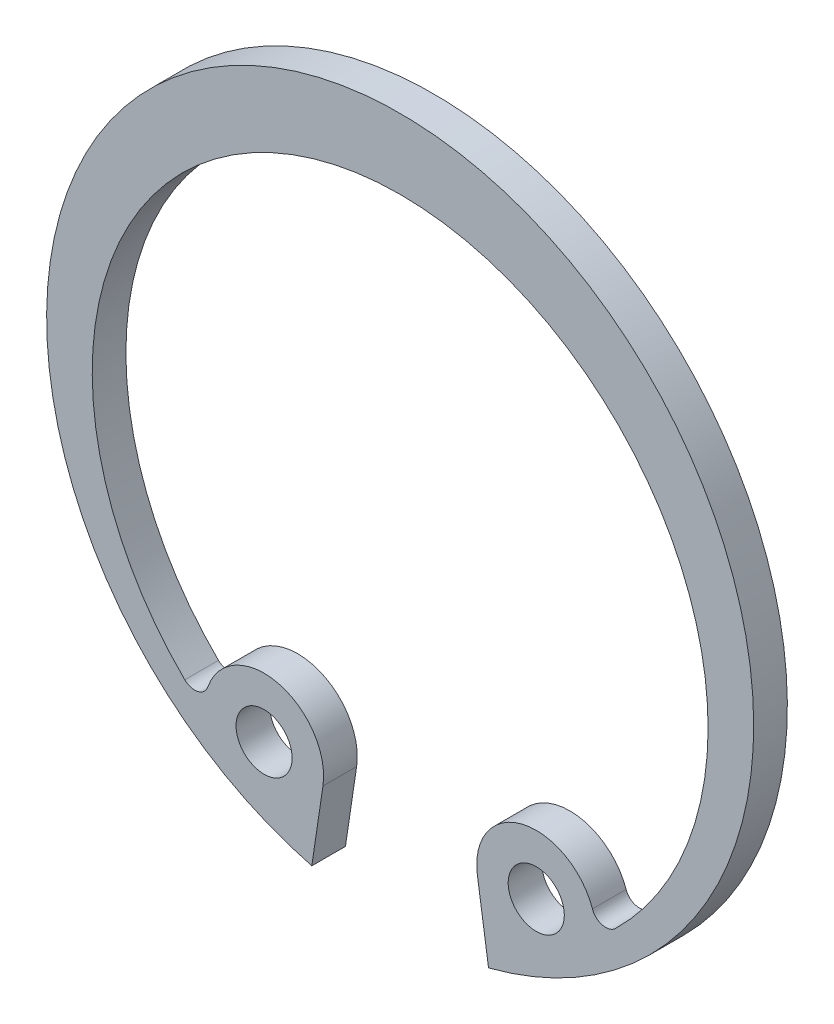
ISO-10303-21;
HEADER;
FILE_DESCRIPTION(('STEP AP214'),'2;1');
FILE_NAME('part.step','',(''),(''),'','','');
FILE_SCHEMA(('AUTOMOTIVE_DESIGN { 1 0 10303 214 1 1 1 1 }'));
ENDSEC;
DATA;
#1=APPLICATION_CONTEXT('core data for automotive mechanical design processes');
#2=APPLICATION_PROTOCOL_DEFINITION('international standard','automotive_design',2000,#1);
#3=PRODUCT_CONTEXT('',#1,'mechanical');
#4=PRODUCT('Part','Part','',(#3));
#5=PRODUCT_RELATED_PRODUCT_CATEGORY('part','',(#4));
#6=PRODUCT_DEFINITION_FORMATION('','',#4);
#7=PRODUCT_DEFINITION_CONTEXT('part definition',#1,'design');
#8=PRODUCT_DEFINITION('design','',#6,#7);
#9=PRODUCT_DEFINITION_SHAPE('','',#8);
#10=(LENGTH_UNIT() NAMED_UNIT(*) SI_UNIT(.MILLI.,.METRE.));
#11=(NAMED_UNIT(*) PLANE_ANGLE_UNIT() SI_UNIT($,.RADIAN.));
#12=(NAMED_UNIT(*) SI_UNIT($,.STERADIAN.) SOLID_ANGLE_UNIT());
#13=UNCERTAINTY_MEASURE_WITH_UNIT(LENGTH_MEASURE(1.E-05),#10,'distance_accuracy_value','');
#14=(GEOMETRIC_REPRESENTATION_CONTEXT(3) GLOBAL_UNCERTAINTY_ASSIGNED_CONTEXT((#13)) GLOBAL_UNIT_ASSIGNED_CONTEXT((#10,
#11,#12)) REPRESENTATION_CONTEXT('',''));
#15=CARTESIAN_POINT('',(0.,0.,0.));
#16=DIRECTION('',(0.,0.,1.));
#17=DIRECTION('',(1.,0.,0.));
#18=AXIS2_PLACEMENT_3D('',#15,#16,#17);
#19=CARTESIAN_POINT('',(-4.85,-9.22384113406593,1.2));
#20=DIRECTION('',(0.,0.,1.));
#21=DIRECTION('',(1.,0.,0.));
#22=AXIS2_PLACEMENT_3D('',#19,#20,#21);
#23=PLANE('',#22);
#24=CARTESIAN_POINT('',(-4.85,-9.22384113406593,1.2));
#25=DIRECTION('',(0.,0.,1.));
#26=DIRECTION('',(1.,0.,0.));
#27=AXIS2_PLACEMENT_3D('',#24,#25,#26);
#28=CIRCLE('',#27,1.);
#29=CARTESIAN_POINT('',(-3.85,-9.22384113406593,1.2));
#30=VERTEX_POINT('',#29);
#31=EDGE_CURVE('E134',#30,#30,#28,.T.);
#32=ORIENTED_EDGE('',*,*,#31,.F.);
#33=EDGE_LOOP('',(#32));
#34=FACE_BOUND('',#33,.T.);
#35=CARTESIAN_POINT('',(-4.85,-9.22384113406593,1.2));
#36=DIRECTION('',(0.,0.,1.));
#37=DIRECTION('',(1.,0.,0.));
#38=AXIS2_PLACEMENT_3D('',#35,#36,#37);
#39=CIRCLE('',#38,2.12121611264667);
#40=CARTESIAN_POINT('',(-2.75208361497354,-9.53737683855488,1.2));
#41=VERTEX_POINT('',#40);
#42=CARTESIAN_POINT('',(-6.85338907081207,-8.52671128425128,1.2));
#43=VERTEX_POINT('',#42);
#44=EDGE_CURVE('E145',#41,#43,#39,.T.);
#45=ORIENTED_EDGE('',*,*,#44,.T.);
#46=CARTESIAN_POINT('',(-7.32561560606887,-8.3623881288551,1.2));
#47=DIRECTION('',(0.,0.,-1.));
#48=DIRECTION('',(1.,0.,0.));
#49=AXIS2_PLACEMENT_3D('',#46,#47,#48);
#50=CIRCLE('',#49,0.499999999999999);
#51=CARTESIAN_POINT('',(-7.67528699538004,-8.71978135696273,1.2));
#52=VERTEX_POINT('',#51);
#53=EDGE_CURVE('E93',#43,#52,#50,.T.);
#54=ORIENTED_EDGE('',*,*,#53,.T.);
#55=CARTESIAN_POINT('',(0.,-0.875000000000001,1.2));
#56=DIRECTION('',(0.,0.,-1.));
#57=DIRECTION('',(1.,0.,0.));
#58=AXIS2_PLACEMENT_3D('',#55,#56,#57);
#59=CIRCLE('',#58,10.975);
#60=CARTESIAN_POINT('',(7.67528699538004,-8.71978135696274,1.2));
#61=VERTEX_POINT('',#60);
#62=EDGE_CURVE('E160',#52,#61,#59,.T.);
#63=ORIENTED_EDGE('',*,*,#62,.T.);
#64=CARTESIAN_POINT('',(7.32561560606887,-8.3623881288551,1.2));
#65=DIRECTION('',(0.,0.,-1.));
#66=DIRECTION('',(-1.,0.,0.));
#67=AXIS2_PLACEMENT_3D('',#64,#65,#66);
#68=CIRCLE('',#67,0.499999999999999);
#69=CARTESIAN_POINT('',(6.85338907081207,-8.52671128425128,1.2));
#70=VERTEX_POINT('',#69);
#71=EDGE_CURVE('E173',#61,#70,#68,.T.);
#72=ORIENTED_EDGE('',*,*,#71,.T.);
#73=CARTESIAN_POINT('',(4.85,-9.22384113406593,1.2));
#74=DIRECTION('',(0.,0.,1.));
#75=DIRECTION('',(1.,0.,0.));
#76=AXIS2_PLACEMENT_3D('',#73,#74,#75);
#77=CIRCLE('',#76,2.12121611264667);
#78=CARTESIAN_POINT('',(2.75208361497354,-9.53737683855488,1.2));
#79=VERTEX_POINT('',#78);
#80=EDGE_CURVE('E112',#70,#79,#77,.T.);
#81=ORIENTED_EDGE('',*,*,#80,.T.);
#82=DIRECTION('',(0.147809411129611,-0.989015863361917,0.));
#83=VECTOR('',#82,1.);
#84=CARTESIAN_POINT('',(2.75208361497354,-9.53737683855488,1.2));
#85=LINE('',#84,#83);
#86=CARTESIAN_POINT('',(3.15,-12.1998975405534,1.2));
#87=VERTEX_POINT('',#86);
#88=EDGE_CURVE('E106',#79,#87,#85,.T.);
#89=ORIENTED_EDGE('',*,*,#88,.T.);
#90=CARTESIAN_POINT('',(0.,0.,1.2));
#91=DIRECTION('',(0.,0.,1.));
#92=DIRECTION('',(1.,0.,0.));
#93=AXIS2_PLACEMENT_3D('',#90,#91,#92);
#94=CIRCLE('',#93,12.6);
#95=CARTESIAN_POINT('',(-3.15,-12.1998975405534,1.2));
#96=VERTEX_POINT('',#95);
#97=EDGE_CURVE('E110',#87,#96,#94,.T.);
#98=ORIENTED_EDGE('',*,*,#97,.T.);
#99=DIRECTION('',(0.147809411129611,0.989015863361917,0.));
#100=VECTOR('',#99,1.);
#101=CARTESIAN_POINT('',(-2.75208361497354,-9.53737683855488,1.2));
#102=LINE('',#101,#100);
#103=EDGE_CURVE('E50',#96,#41,#102,.T.);
#104=ORIENTED_EDGE('',*,*,#103,.T.);
#105=EDGE_LOOP('',(#45,#54,#63,#72,#81,#89,#98,#104));
#106=FACE_BOUND('',#105,.T.);
#107=CARTESIAN_POINT('',(4.85,-9.22384113406593,1.2));
#108=DIRECTION('',(0.,0.,1.));
#109=DIRECTION('',(1.,0.,0.));
#110=AXIS2_PLACEMENT_3D('',#107,#108,#109);
#111=CIRCLE('',#110,1.);
#112=CARTESIAN_POINT('',(5.85,-9.22384113406593,1.2));
#113=VERTEX_POINT('',#112);
#114=EDGE_CURVE('E182',#113,#113,#111,.T.);
#115=ORIENTED_EDGE('',*,*,#114,.F.);
#116=EDGE_LOOP('',(#115));
#117=FACE_BOUND('',#116,.T.);
#118=ADVANCED_FACE('F33',(#34,#106,#117),#23,.T.);
#119=CARTESIAN_POINT('',(-4.85,-9.22384113406593,0.));
#120=DIRECTION('',(0.,0.,1.));
#121=DIRECTION('',(1.,0.,0.));
#122=AXIS2_PLACEMENT_3D('',#119,#120,#121);
#123=PLANE('',#122);
#124=CARTESIAN_POINT('',(-4.85,-9.22384113406593,0.));
#125=DIRECTION('',(0.,0.,1.));
#126=DIRECTION('',(1.,0.,0.));
#127=AXIS2_PLACEMENT_3D('',#124,#125,#126);
#128=CIRCLE('',#127,2.12121611264667);
#129=CARTESIAN_POINT('',(-2.75208361497354,-9.53737683855488,0.));
#130=VERTEX_POINT('',#129);
#131=CARTESIAN_POINT('',(-6.85338907081207,-8.52671128425128,0.));
#132=VERTEX_POINT('',#131);
#133=EDGE_CURVE('E130',#130,#132,#128,.T.);
#134=ORIENTED_EDGE('',*,*,#133,.F.);
#135=DIRECTION('',(0.147809411129611,0.989015863361917,0.));
#136=VECTOR('',#135,1.);
#137=CARTESIAN_POINT('',(-2.75208361497354,-9.53737683855488,0.));
#138=LINE('',#137,#136);
#139=CARTESIAN_POINT('',(-3.15,-12.1998975405534,0.));
#140=VERTEX_POINT('',#139);
#141=EDGE_CURVE('E85',#140,#130,#138,.T.);
#142=ORIENTED_EDGE('',*,*,#141,.F.);
#143=CARTESIAN_POINT('',(0.,0.,0.));
#144=DIRECTION('',(0.,0.,1.));
#145=DIRECTION('',(1.,0.,0.));
#146=AXIS2_PLACEMENT_3D('',#143,#144,#145);
#147=CIRCLE('',#146,12.6);
#148=CARTESIAN_POINT('',(3.15,-12.1998975405534,0.));
#149=VERTEX_POINT('',#148);
#150=EDGE_CURVE('E79',#149,#140,#147,.T.);
#151=ORIENTED_EDGE('',*,*,#150,.F.);
#152=DIRECTION('',(0.147809411129611,-0.989015863361917,0.));
#153=VECTOR('',#152,1.);
#154=CARTESIAN_POINT('',(2.75208361497354,-9.53737683855488,0.));
#155=LINE('',#154,#153);
#156=CARTESIAN_POINT('',(2.75208361497354,-9.53737683855488,0.));
#157=VERTEX_POINT('',#156);
#158=EDGE_CURVE('E120',#157,#149,#155,.T.);
#159=ORIENTED_EDGE('',*,*,#158,.F.);
#160=CARTESIAN_POINT('',(4.85,-9.22384113406593,0.));
#161=DIRECTION('',(0.,0.,1.));
#162=DIRECTION('',(1.,0.,0.));
#163=AXIS2_PLACEMENT_3D('',#160,#161,#162);
#164=CIRCLE('',#163,2.12121611264667);
#165=CARTESIAN_POINT('',(6.85338907081207,-8.52671128425128,0.));
#166=VERTEX_POINT('',#165);
#167=EDGE_CURVE('E140',#166,#157,#164,.T.);
#168=ORIENTED_EDGE('',*,*,#167,.F.);
#169=CARTESIAN_POINT('',(7.32561560606887,-8.3623881288551,0.));
#170=DIRECTION('',(0.,0.,-1.));
#171=DIRECTION('',(-1.,0.,0.));
#172=AXIS2_PLACEMENT_3D('',#169,#170,#171);
#173=CIRCLE('',#172,0.499999999999999);
#174=CARTESIAN_POINT('',(7.67528699538004,-8.71978135696274,0.));
#175=VERTEX_POINT('',#174);
#176=EDGE_CURVE('E138',#175,#166,#173,.T.);
#177=ORIENTED_EDGE('',*,*,#176,.F.);
#178=CARTESIAN_POINT('',(0.,-0.875000000000001,0.));
#179=DIRECTION('',(0.,0.,-1.));
#180=DIRECTION('',(1.,0.,0.));
#181=AXIS2_PLACEMENT_3D('',#178,#179,#180);
#182=CIRCLE('',#181,10.975);
#183=CARTESIAN_POINT('',(-7.67528699538004,-8.71978135696273,0.));
#184=VERTEX_POINT('',#183);
#185=EDGE_CURVE('E136',#184,#175,#182,.T.);
#186=ORIENTED_EDGE('',*,*,#185,.F.);
#187=CARTESIAN_POINT('',(-7.32561560606887,-8.3623881288551,0.));
#188=DIRECTION('',(0.,0.,-1.));
#189=DIRECTION('',(1.,0.,0.));
#190=AXIS2_PLACEMENT_3D('',#187,#188,#189);
#191=CIRCLE('',#190,0.499999999999999);
#192=EDGE_CURVE('E133',#132,#184,#191,.T.);
#193=ORIENTED_EDGE('',*,*,#192,.F.);
#194=EDGE_LOOP('',(#134,#142,#151,#159,#168,#177,#186,#193));
#195=FACE_BOUND('',#194,.T.);
#196=CARTESIAN_POINT('',(-4.85,-9.22384113406593,0.));
#197=DIRECTION('',(0.,0.,1.));
#198=DIRECTION('',(1.,0.,0.));
#199=AXIS2_PLACEMENT_3D('',#196,#197,#198);
#200=CIRCLE('',#199,1.);
#201=CARTESIAN_POINT('',(-3.85,-9.22384113406593,0.));
#202=VERTEX_POINT('',#201);
#203=EDGE_CURVE('E179',#202,#202,#200,.T.);
#204=ORIENTED_EDGE('',*,*,#203,.T.);
#205=EDGE_LOOP('',(#204));
#206=FACE_BOUND('',#205,.T.);
#207=CARTESIAN_POINT('',(4.85,-9.22384113406593,0.));
#208=DIRECTION('',(0.,0.,1.));
#209=DIRECTION('',(1.,0.,0.));
#210=AXIS2_PLACEMENT_3D('',#207,#208,#209);
#211=CIRCLE('',#210,1.);
#212=CARTESIAN_POINT('',(5.85,-9.22384113406593,0.));
#213=VERTEX_POINT('',#212);
#214=EDGE_CURVE('E185',#213,#213,#211,.T.);
#215=ORIENTED_EDGE('',*,*,#214,.T.);
#216=EDGE_LOOP('',(#215));
#217=FACE_BOUND('',#216,.T.);
#218=ADVANCED_FACE('F164',(#195,#206,#217),#123,.F.);
#219=CARTESIAN_POINT('',(-4.85,-9.22384113406593,1.2));
#220=DIRECTION('',(0.,0.,-1.));
#221=DIRECTION('',(-1.,0.,0.));
#222=AXIS2_PLACEMENT_3D('',#219,#220,#221);
#223=CYLINDRICAL_SURFACE('',#222,2.12121611264667);
#224=ORIENTED_EDGE('',*,*,#133,.T.);
#225=DIRECTION('',(0.,0.,-1.));
#226=VECTOR('',#225,1.);
#227=CARTESIAN_POINT('',(-6.85338907081207,-8.52671128425128,1.2));
#228=LINE('',#227,#226);
#229=EDGE_CURVE('E11',#43,#132,#228,.T.);
#230=ORIENTED_EDGE('',*,*,#229,.F.);
#231=ORIENTED_EDGE('',*,*,#44,.F.);
#232=DIRECTION('',(0.,0.,-1.));
#233=VECTOR('',#232,1.);
#234=CARTESIAN_POINT('',(-2.75208361497354,-9.53737683855488,1.2));
#235=LINE('',#234,#233);
#236=EDGE_CURVE('E126',#41,#130,#235,.T.);
#237=ORIENTED_EDGE('',*,*,#236,.T.);
#238=EDGE_LOOP('',(#224,#230,#231,#237));
#239=FACE_BOUND('',#238,.T.);
#240=ADVANCED_FACE('F35',(#239),#223,.T.);
#241=CARTESIAN_POINT('',(-7.32561560606887,-8.3623881288551,1.2));
#242=DIRECTION('',(0.,0.,-1.));
#243=DIRECTION('',(-1.,0.,0.));
#244=AXIS2_PLACEMENT_3D('',#241,#242,#243);
#245=CYLINDRICAL_SURFACE('',#244,0.499999999999999);
#246=ORIENTED_EDGE('',*,*,#192,.T.);
#247=DIRECTION('',(0.,0.,-1.));
#248=VECTOR('',#247,1.);
#249=CARTESIAN_POINT('',(-7.67528699538004,-8.71978135696273,1.2));
#250=LINE('',#249,#248);
#251=EDGE_CURVE('E42',#52,#184,#250,.T.);
#252=ORIENTED_EDGE('',*,*,#251,.F.);
#253=ORIENTED_EDGE('',*,*,#53,.F.);
#254=ORIENTED_EDGE('',*,*,#229,.T.);
#255=EDGE_LOOP('',(#246,#252,#253,#254));
#256=FACE_BOUND('',#255,.T.);
#257=ADVANCED_FACE('F217',(#256),#245,.F.);
#258=CARTESIAN_POINT('',(0.,-0.875000000000001,1.2));
#259=DIRECTION('',(0.,0.,-1.));
#260=DIRECTION('',(-1.,0.,0.));
#261=AXIS2_PLACEMENT_3D('',#258,#259,#260);
#262=CYLINDRICAL_SURFACE('',#261,10.975);
#263=ORIENTED_EDGE('',*,*,#185,.T.);
#264=DIRECTION('',(0.,0.,-1.));
#265=VECTOR('',#264,1.);
#266=CARTESIAN_POINT('',(7.67528699538004,-8.71978135696274,1.2));
#267=LINE('',#266,#265);
#268=EDGE_CURVE('E152',#61,#175,#267,.T.);
#269=ORIENTED_EDGE('',*,*,#268,.F.);
#270=ORIENTED_EDGE('',*,*,#62,.F.);
#271=ORIENTED_EDGE('',*,*,#251,.T.);
#272=EDGE_LOOP('',(#263,#269,#270,#271));
#273=FACE_BOUND('',#272,.T.);
#274=ADVANCED_FACE('F158',(#273),#262,.F.);
#275=CARTESIAN_POINT('',(7.32561560606887,-8.3623881288551,1.2));
#276=DIRECTION('',(0.,0.,-1.));
#277=DIRECTION('',(-1.,0.,0.));
#278=AXIS2_PLACEMENT_3D('',#275,#276,#277);
#279=CYLINDRICAL_SURFACE('',#278,0.499999999999999);
#280=ORIENTED_EDGE('',*,*,#176,.T.);
#281=DIRECTION('',(0.,0.,-1.));
#282=VECTOR('',#281,1.);
#283=CARTESIAN_POINT('',(6.85338907081207,-8.52671128425128,1.2));
#284=LINE('',#283,#282);
#285=EDGE_CURVE('E149',#70,#166,#284,.T.);
#286=ORIENTED_EDGE('',*,*,#285,.F.);
#287=ORIENTED_EDGE('',*,*,#71,.F.);
#288=ORIENTED_EDGE('',*,*,#268,.T.);
#289=EDGE_LOOP('',(#280,#286,#287,#288));
#290=FACE_BOUND('',#289,.T.);
#291=ADVANCED_FACE('F169',(#290),#279,.F.);
#292=CARTESIAN_POINT('',(4.85,-9.22384113406593,1.2));
#293=DIRECTION('',(0.,0.,-1.));
#294=DIRECTION('',(-1.,0.,0.));
#295=AXIS2_PLACEMENT_3D('',#292,#293,#294);
#296=CYLINDRICAL_SURFACE('',#295,2.12121611264667);
#297=ORIENTED_EDGE('',*,*,#167,.T.);
#298=DIRECTION('',(0.,0.,-1.));
#299=VECTOR('',#298,1.);
#300=CARTESIAN_POINT('',(2.75208361497354,-9.53737683855488,1.2));
#301=LINE('',#300,#299);
#302=EDGE_CURVE('E121',#79,#157,#301,.T.);
#303=ORIENTED_EDGE('',*,*,#302,.F.);
#304=ORIENTED_EDGE('',*,*,#80,.F.);
#305=ORIENTED_EDGE('',*,*,#285,.T.);
#306=EDGE_LOOP('',(#297,#303,#304,#305));
#307=FACE_BOUND('',#306,.T.);
#308=ADVANCED_FACE('F172',(#307),#296,.T.);
#309=CARTESIAN_POINT('',(2.75208361497354,-9.53737683855488,1.2));
#310=DIRECTION('',(0.989015863361917,0.147809411129611,0.));
#311=DIRECTION('',(-0.147809411129611,0.989015863361917,0.));
#312=AXIS2_PLACEMENT_3D('',#309,#310,#311);
#313=PLANE('',#312);
#314=ORIENTED_EDGE('',*,*,#158,.T.);
#315=DIRECTION('',(0.,0.,-1.));
#316=VECTOR('',#315,1.);
#317=CARTESIAN_POINT('',(3.15,-12.1998975405534,1.2));
#318=LINE('',#317,#316);
#319=EDGE_CURVE('E117',#87,#149,#318,.T.);
#320=ORIENTED_EDGE('',*,*,#319,.F.);
#321=ORIENTED_EDGE('',*,*,#88,.F.);
#322=ORIENTED_EDGE('',*,*,#302,.T.);
#323=EDGE_LOOP('',(#314,#320,#321,#322));
#324=FACE_BOUND('',#323,.T.);
#325=ADVANCED_FACE('F118',(#324),#313,.F.);
#326=CARTESIAN_POINT('',(0.,0.,1.2));
#327=DIRECTION('',(0.,0.,-1.));
#328=DIRECTION('',(-1.,0.,0.));
#329=AXIS2_PLACEMENT_3D('',#326,#327,#328);
#330=CYLINDRICAL_SURFACE('',#329,12.6);
#331=ORIENTED_EDGE('',*,*,#150,.T.);
#332=DIRECTION('',(0.,0.,-1.));
#333=VECTOR('',#332,1.);
#334=CARTESIAN_POINT('',(-3.15,-12.1998975405534,1.2));
#335=LINE('',#334,#333);
#336=EDGE_CURVE('E122',#96,#140,#335,.T.);
#337=ORIENTED_EDGE('',*,*,#336,.F.);
#338=ORIENTED_EDGE('',*,*,#97,.F.);
#339=ORIENTED_EDGE('',*,*,#319,.T.);
#340=EDGE_LOOP('',(#331,#337,#338,#339));
#341=FACE_BOUND('',#340,.T.);
#342=ADVANCED_FACE('F124',(#341),#330,.T.);
#343=CARTESIAN_POINT('',(-2.75208361497354,-9.53737683855488,1.2));
#344=DIRECTION('',(-0.989015863361917,0.147809411129611,0.));
#345=DIRECTION('',(-0.147809411129611,-0.989015863361917,0.));
#346=AXIS2_PLACEMENT_3D('',#343,#344,#345);
#347=PLANE('',#346);
#348=ORIENTED_EDGE('',*,*,#141,.T.);
#349=ORIENTED_EDGE('',*,*,#236,.F.);
#350=ORIENTED_EDGE('',*,*,#103,.F.);
#351=ORIENTED_EDGE('',*,*,#336,.T.);
#352=EDGE_LOOP('',(#348,#349,#350,#351));
#353=FACE_BOUND('',#352,.T.);
#354=ADVANCED_FACE('F205',(#353),#347,.F.);
#355=CARTESIAN_POINT('',(-4.85,-9.22384113406593,1.2));
#356=DIRECTION('',(0.,0.,-1.));
#357=DIRECTION('',(-1.,0.,0.));
#358=AXIS2_PLACEMENT_3D('',#355,#356,#357);
#359=CYLINDRICAL_SURFACE('',#358,1.);
#360=ORIENTED_EDGE('',*,*,#31,.T.);
#361=EDGE_LOOP('',(#360));
#362=FACE_BOUND('',#361,.T.);
#363=ORIENTED_EDGE('',*,*,#203,.F.);
#364=EDGE_LOOP('',(#363));
#365=FACE_BOUND('',#364,.T.);
#366=ADVANCED_FACE('F202',(#362,#365),#359,.F.);
#367=CARTESIAN_POINT('',(4.85,-9.22384113406593,1.2));
#368=DIRECTION('',(0.,0.,-1.));
#369=DIRECTION('',(-1.,0.,0.));
#370=AXIS2_PLACEMENT_3D('',#367,#368,#369);
#371=CYLINDRICAL_SURFACE('',#370,1.);
#372=ORIENTED_EDGE('',*,*,#114,.T.);
#373=EDGE_LOOP('',(#372));
#374=FACE_BOUND('',#373,.T.);
#375=ORIENTED_EDGE('',*,*,#214,.F.);
#376=EDGE_LOOP('',(#375));
#377=FACE_BOUND('',#376,.T.);
#378=ADVANCED_FACE('F191',(#374,#377),#371,.F.);
#379=CLOSED_SHELL('',(#118,#218,#240,#257,#274,#291,#308,#325,#342,#354,#366,#378));
#380=MANIFOLD_SOLID_BREP('B2',#379);
#381=ADVANCED_BREP_SHAPE_REPRESENTATION('',(#18,#380),#14);
#382=SHAPE_DEFINITION_REPRESENTATION(#9,#381);
ENDSEC;
END-ISO-10303-21;
